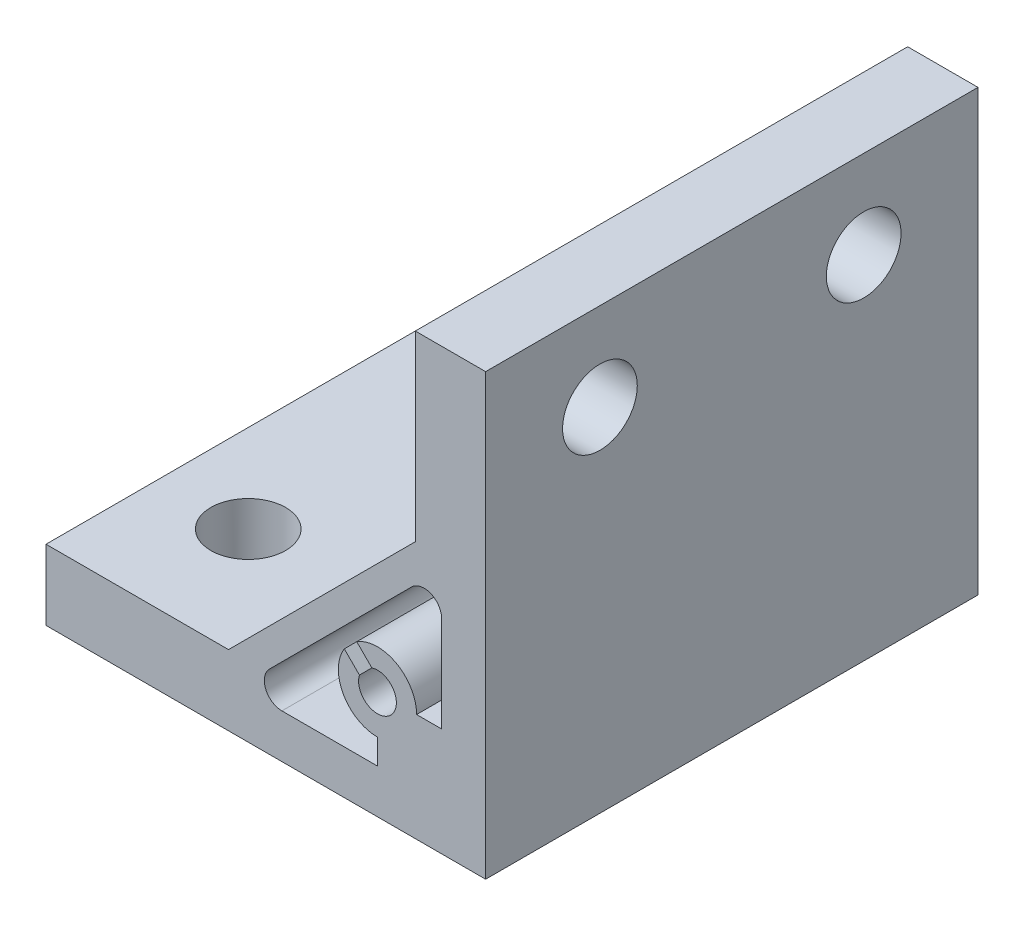
ISO-10303-21;
HEADER;
FILE_DESCRIPTION(('STEP AP214'),'2;1');
FILE_NAME('part.step','',(''),(''),'','','');
FILE_SCHEMA(('AUTOMOTIVE_DESIGN { 1 0 10303 214 1 1 1 1 }'));
ENDSEC;
DATA;
#1=APPLICATION_CONTEXT('core data for automotive mechanical design processes');
#2=APPLICATION_PROTOCOL_DEFINITION('international standard','automotive_design',2000,#1);
#3=PRODUCT_CONTEXT('',#1,'mechanical');
#4=PRODUCT('Part','Part','',(#3));
#5=PRODUCT_RELATED_PRODUCT_CATEGORY('part','',(#4));
#6=PRODUCT_DEFINITION_FORMATION('','',#4);
#7=PRODUCT_DEFINITION_CONTEXT('part definition',#1,'design');
#8=PRODUCT_DEFINITION('design','',#6,#7);
#9=PRODUCT_DEFINITION_SHAPE('','',#8);
#10=(LENGTH_UNIT() NAMED_UNIT(*) SI_UNIT(.MILLI.,.METRE.));
#11=(NAMED_UNIT(*) PLANE_ANGLE_UNIT() SI_UNIT($,.RADIAN.));
#12=(NAMED_UNIT(*) SI_UNIT($,.STERADIAN.) SOLID_ANGLE_UNIT());
#13=UNCERTAINTY_MEASURE_WITH_UNIT(LENGTH_MEASURE(1.E-05),#10,'distance_accuracy_value','');
#14=(GEOMETRIC_REPRESENTATION_CONTEXT(3) GLOBAL_UNCERTAINTY_ASSIGNED_CONTEXT((#13)) GLOBAL_UNIT_ASSIGNED_CONTEXT((#10,
#11,#12)) REPRESENTATION_CONTEXT('',''));
#15=CARTESIAN_POINT('',(0.,0.,0.));
#16=DIRECTION('',(0.,0.,1.));
#17=DIRECTION('',(1.,0.,0.));
#18=AXIS2_PLACEMENT_3D('',#15,#16,#17);
#19=CARTESIAN_POINT('',(50.,0.,28.));
#20=DIRECTION('',(-1.,0.,0.));
#21=DIRECTION('',(0.,0.,1.));
#22=AXIS2_PLACEMENT_3D('',#19,#20,#21);
#23=PLANE('',#22);
#24=CARTESIAN_POINT('',(50.,40.,-15.));
#25=DIRECTION('',(-1.,0.,0.));
#26=DIRECTION('',(0.,0.,1.));
#27=AXIS2_PLACEMENT_3D('',#24,#25,#26);
#28=CIRCLE('',#27,4.25);
#29=CARTESIAN_POINT('',(50.,40.,-10.75));
#30=VERTEX_POINT('',#29);
#31=EDGE_CURVE('E381',#30,#30,#28,.F.);
#32=ORIENTED_EDGE('',*,*,#31,.F.);
#33=EDGE_LOOP('',(#32));
#34=FACE_BOUND('',#33,.T.);
#35=DIRECTION('',(0.,1.,0.));
#36=VECTOR('',#35,1.);
#37=CARTESIAN_POINT('',(50.,0.,-28.));
#38=LINE('',#37,#36);
#39=CARTESIAN_POINT('',(50.,0.,-28.));
#40=VERTEX_POINT('',#39);
#41=CARTESIAN_POINT('',(50.,50.,-28.));
#42=VERTEX_POINT('',#41);
#43=EDGE_CURVE('E283',#40,#42,#38,.T.);
#44=ORIENTED_EDGE('',*,*,#43,.T.);
#45=DIRECTION('',(0.,0.,-1.));
#46=VECTOR('',#45,1.);
#47=CARTESIAN_POINT('',(50.,50.,28.));
#48=LINE('',#47,#46);
#49=CARTESIAN_POINT('',(50.,50.,28.));
#50=VERTEX_POINT('',#49);
#51=EDGE_CURVE('E303',#50,#42,#48,.T.);
#52=ORIENTED_EDGE('',*,*,#51,.F.);
#53=DIRECTION('',(0.,1.,0.));
#54=VECTOR('',#53,1.);
#55=CARTESIAN_POINT('',(50.,0.,28.));
#56=LINE('',#55,#54);
#57=CARTESIAN_POINT('',(50.,0.,28.));
#58=VERTEX_POINT('',#57);
#59=EDGE_CURVE('E268',#58,#50,#56,.T.);
#60=ORIENTED_EDGE('',*,*,#59,.F.);
#61=DIRECTION('',(0.,0.,-1.));
#62=VECTOR('',#61,1.);
#63=CARTESIAN_POINT('',(50.,0.,28.));
#64=LINE('',#63,#62);
#65=EDGE_CURVE('E43',#58,#40,#64,.T.);
#66=ORIENTED_EDGE('',*,*,#65,.T.);
#67=EDGE_LOOP('',(#44,#52,#60,#66));
#68=FACE_BOUND('',#67,.T.);
#69=CARTESIAN_POINT('',(50.,40.,15.));
#70=DIRECTION('',(-1.,0.,0.));
#71=DIRECTION('',(0.,0.,1.));
#72=AXIS2_PLACEMENT_3D('',#69,#70,#71);
#73=CIRCLE('',#72,4.25);
#74=CARTESIAN_POINT('',(50.,40.,19.25));
#75=VERTEX_POINT('',#74);
#76=EDGE_CURVE('E387',#75,#75,#73,.F.);
#77=ORIENTED_EDGE('',*,*,#76,.F.);
#78=EDGE_LOOP('',(#77));
#79=FACE_BOUND('',#78,.T.);
#80=ADVANCED_FACE('F35',(#34,#68,#79),#23,.F.);
#81=CARTESIAN_POINT('',(42.,29.2426406871192,28.));
#82=DIRECTION('',(1.,0.,0.));
#83=DIRECTION('',(0.,0.,-1.));
#84=AXIS2_PLACEMENT_3D('',#81,#82,#83);
#85=PLANE('',#84);
#86=CARTESIAN_POINT('',(42.0000000000001,40.,-15.));
#87=DIRECTION('',(1.,0.,0.));
#88=DIRECTION('',(0.,0.,1.));
#89=AXIS2_PLACEMENT_3D('',#86,#87,#88);
#90=CIRCLE('',#89,4.25);
#91=CARTESIAN_POINT('',(42.0000000000001,40.,-10.75));
#92=VERTEX_POINT('',#91);
#93=EDGE_CURVE('E384',#92,#92,#90,.T.);
#94=ORIENTED_EDGE('',*,*,#93,.T.);
#95=EDGE_LOOP('',(#94));
#96=FACE_BOUND('',#95,.T.);
#97=DIRECTION('',(0.,-1.,0.));
#98=VECTOR('',#97,1.);
#99=CARTESIAN_POINT('',(42.,29.2426406871192,-28.));
#100=LINE('',#99,#98);
#101=CARTESIAN_POINT('',(42.,50.,-28.));
#102=VERTEX_POINT('',#101);
#103=CARTESIAN_POINT('',(42.,29.2426406871192,-28.));
#104=VERTEX_POINT('',#103);
#105=EDGE_CURVE('E287',#102,#104,#100,.T.);
#106=ORIENTED_EDGE('',*,*,#105,.T.);
#107=DIRECTION('',(0.,0.,-1.));
#108=VECTOR('',#107,1.);
#109=CARTESIAN_POINT('',(42.,29.2426406871192,28.));
#110=LINE('',#109,#108);
#111=CARTESIAN_POINT('',(42.,29.2426406871192,28.));
#112=VERTEX_POINT('',#111);
#113=EDGE_CURVE('E297',#112,#104,#110,.T.);
#114=ORIENTED_EDGE('',*,*,#113,.F.);
#115=DIRECTION('',(0.,-1.,0.));
#116=VECTOR('',#115,1.);
#117=CARTESIAN_POINT('',(42.,29.2426406871192,28.));
#118=LINE('',#117,#116);
#119=CARTESIAN_POINT('',(42.,50.,28.));
#120=VERTEX_POINT('',#119);
#121=EDGE_CURVE('E272',#120,#112,#118,.T.);
#122=ORIENTED_EDGE('',*,*,#121,.F.);
#123=DIRECTION('',(0.,0.,-1.));
#124=VECTOR('',#123,1.);
#125=CARTESIAN_POINT('',(42.,50.,28.));
#126=LINE('',#125,#124);
#127=EDGE_CURVE('E300',#120,#102,#126,.T.);
#128=ORIENTED_EDGE('',*,*,#127,.T.);
#129=EDGE_LOOP('',(#106,#114,#122,#128));
#130=FACE_BOUND('',#129,.T.);
#131=CARTESIAN_POINT('',(42.0000000000001,40.,15.));
#132=DIRECTION('',(1.,0.,0.));
#133=DIRECTION('',(0.,0.,-1.));
#134=AXIS2_PLACEMENT_3D('',#131,#132,#133);
#135=CIRCLE('',#134,4.25);
#136=CARTESIAN_POINT('',(42.0000000000001,40.,10.75));
#137=VERTEX_POINT('',#136);
#138=EDGE_CURVE('E390',#137,#137,#135,.T.);
#139=ORIENTED_EDGE('',*,*,#138,.T.);
#140=EDGE_LOOP('',(#139));
#141=FACE_BOUND('',#140,.T.);
#142=ADVANCED_FACE('F326',(#96,#130,#141),#85,.F.);
#143=CARTESIAN_POINT('',(0.,0.,28.));
#144=DIRECTION('',(0.,0.,1.));
#145=DIRECTION('',(1.,0.,0.));
#146=AXIS2_PLACEMENT_3D('',#143,#144,#145);
#147=PLANE('',#146);
#148=DIRECTION('',(0.,-1.,0.));
#149=VECTOR('',#148,1.);
#150=CARTESIAN_POINT('',(0.,8.,28.));
#151=LINE('',#150,#149);
#152=CARTESIAN_POINT('',(0.,8.,28.));
#153=VERTEX_POINT('',#152);
#154=CARTESIAN_POINT('',(0.,0.,28.));
#155=VERTEX_POINT('',#154);
#156=EDGE_CURVE('E262',#153,#155,#151,.T.);
#157=ORIENTED_EDGE('',*,*,#156,.T.);
#158=DIRECTION('',(1.,0.,0.));
#159=VECTOR('',#158,1.);
#160=CARTESIAN_POINT('',(0.,0.,28.));
#161=LINE('',#160,#159);
#162=EDGE_CURVE('E265',#155,#58,#161,.T.);
#163=ORIENTED_EDGE('',*,*,#162,.T.);
#164=ORIENTED_EDGE('',*,*,#59,.T.);
#165=DIRECTION('',(-1.,0.,0.));
#166=VECTOR('',#165,1.);
#167=CARTESIAN_POINT('',(42.,50.,28.));
#168=LINE('',#167,#166);
#169=EDGE_CURVE('E270',#50,#120,#168,.T.);
#170=ORIENTED_EDGE('',*,*,#169,.T.);
#171=ORIENTED_EDGE('',*,*,#121,.T.);
#172=DIRECTION('',(-0.707106781186546,-0.707106781186549,0.));
#173=VECTOR('',#172,1.);
#174=CARTESIAN_POINT('',(20.7573593128809,8.,28.));
#175=LINE('',#174,#173);
#176=CARTESIAN_POINT('',(20.7573593128809,8.,28.));
#177=VERTEX_POINT('',#176);
#178=EDGE_CURVE('E274',#112,#177,#175,.T.);
#179=ORIENTED_EDGE('',*,*,#178,.T.);
#180=DIRECTION('',(-1.,0.,0.));
#181=VECTOR('',#180,1.);
#182=CARTESIAN_POINT('',(0.,8.,28.));
#183=LINE('',#182,#181);
#184=EDGE_CURVE('E276',#177,#153,#183,.T.);
#185=ORIENTED_EDGE('',*,*,#184,.T.);
#186=EDGE_LOOP('',(#157,#163,#164,#170,#171,#179,#185));
#187=FACE_BOUND('',#186,.T.);
#188=DIRECTION('',(0.707106781186549,-0.707106781186546,0.));
#189=VECTOR('',#188,1.);
#190=CARTESIAN_POINT('',(35.647066335444,12.9387201021829,28.));
#191=LINE('',#190,#189);
#192=CARTESIAN_POINT('',(33.9267474297161,14.6590390079109,28.));
#193=VERTEX_POINT('',#192);
#194=CARTESIAN_POINT('',(35.647066335444,12.9387201021829,28.));
#195=VERTEX_POINT('',#194);
#196=EDGE_CURVE('E174',#193,#195,#191,.T.);
#197=ORIENTED_EDGE('',*,*,#196,.F.);
#198=CARTESIAN_POINT('',(37.7,12.3,28.));
#199=DIRECTION('',(0.,0.,-1.));
#200=DIRECTION('',(1.,0.,0.));
#201=AXIS2_PLACEMENT_3D('',#198,#199,#200);
#202=CIRCLE('',#201,4.45);
#203=CARTESIAN_POINT('',(37.7,7.84999999999995,28.));
#204=VERTEX_POINT('',#203);
#205=EDGE_CURVE('E166',#204,#193,#202,.T.);
#206=ORIENTED_EDGE('',*,*,#205,.F.);
#207=DIRECTION('',(0.,1.,0.));
#208=VECTOR('',#207,1.);
#209=CARTESIAN_POINT('',(37.7,5.,28.));
#210=LINE('',#209,#208);
#211=CARTESIAN_POINT('',(37.7,5.,28.));
#212=VERTEX_POINT('',#211);
#213=EDGE_CURVE('E209',#212,#204,#210,.T.);
#214=ORIENTED_EDGE('',*,*,#213,.F.);
#215=DIRECTION('',(1.,0.,0.));
#216=VECTOR('',#215,1.);
#217=CARTESIAN_POINT('',(26.828427124746,5.,28.));
#218=LINE('',#217,#216);
#219=CARTESIAN_POINT('',(26.828427124746,4.99999999999993,28.));
#220=VERTEX_POINT('',#219);
#221=EDGE_CURVE('E207',#220,#212,#218,.T.);
#222=ORIENTED_EDGE('',*,*,#221,.F.);
#223=CARTESIAN_POINT('',(26.8284271247464,7.00000000000011,28.));
#224=DIRECTION('',(0.,0.,1.));
#225=DIRECTION('',(1.,0.,0.));
#226=AXIS2_PLACEMENT_3D('',#223,#224,#225);
#227=CIRCLE('',#226,2.00000000000019);
#228=CARTESIAN_POINT('',(25.4142135623729,8.41421356237311,28.));
#229=VERTEX_POINT('',#228);
#230=EDGE_CURVE('E205',#229,#220,#227,.T.);
#231=ORIENTED_EDGE('',*,*,#230,.F.);
#232=DIRECTION('',(-0.70710678118655,-0.707106781186545,0.));
#233=VECTOR('',#232,1.);
#234=CARTESIAN_POINT('',(25.4142135623729,8.41421356237311,28.));
#235=LINE('',#234,#233);
#236=CARTESIAN_POINT('',(41.585786437627,24.5857864376269,28.));
#237=VERTEX_POINT('',#236);
#238=EDGE_CURVE('E203',#237,#229,#235,.T.);
#239=ORIENTED_EDGE('',*,*,#238,.F.);
#240=CARTESIAN_POINT('',(43.0000000000002,23.171572875254,28.));
#241=DIRECTION('',(0.,0.,1.));
#242=DIRECTION('',(1.,0.,0.));
#243=AXIS2_PLACEMENT_3D('',#240,#241,#242);
#244=CIRCLE('',#243,1.99999999999993);
#245=CARTESIAN_POINT('',(45.,23.1715728752539,28.));
#246=VERTEX_POINT('',#245);
#247=EDGE_CURVE('E201',#246,#237,#244,.T.);
#248=ORIENTED_EDGE('',*,*,#247,.F.);
#249=DIRECTION('',(0.,1.,0.));
#250=VECTOR('',#249,1.);
#251=CARTESIAN_POINT('',(45.,23.1715728752539,28.));
#252=LINE('',#251,#250);
#253=CARTESIAN_POINT('',(45.,12.3,28.));
#254=VERTEX_POINT('',#253);
#255=EDGE_CURVE('E199',#254,#246,#252,.T.);
#256=ORIENTED_EDGE('',*,*,#255,.F.);
#257=DIRECTION('',(1.,0.,0.));
#258=VECTOR('',#257,1.);
#259=CARTESIAN_POINT('',(42.15,12.3,28.));
#260=LINE('',#259,#258);
#261=CARTESIAN_POINT('',(42.15,12.3,28.));
#262=VERTEX_POINT('',#261);
#263=EDGE_CURVE('E197',#262,#254,#260,.T.);
#264=ORIENTED_EDGE('',*,*,#263,.F.);
#265=CARTESIAN_POINT('',(37.7,12.3,28.));
#266=DIRECTION('',(0.,0.,-1.));
#267=DIRECTION('',(1.,0.,0.));
#268=AXIS2_PLACEMENT_3D('',#265,#266,#267);
#269=CIRCLE('',#268,4.45);
#270=CARTESIAN_POINT('',(35.3409609920885,16.0732525702836,28.));
#271=VERTEX_POINT('',#270);
#272=EDGE_CURVE('E195',#271,#262,#269,.T.);
#273=ORIENTED_EDGE('',*,*,#272,.F.);
#274=DIRECTION('',(-0.707106781186684,0.707106781186411,0.));
#275=VECTOR('',#274,1.);
#276=CARTESIAN_POINT('',(37.0612798978168,14.3529336645559,28.));
#277=LINE('',#276,#275);
#278=CARTESIAN_POINT('',(37.0612798978168,14.3529336645559,28.));
#279=VERTEX_POINT('',#278);
#280=EDGE_CURVE('E190',#279,#271,#277,.T.);
#281=ORIENTED_EDGE('',*,*,#280,.F.);
#282=CARTESIAN_POINT('',(37.7,12.3,28.));
#283=DIRECTION('',(0.,0.,1.));
#284=DIRECTION('',(1.,0.,0.));
#285=AXIS2_PLACEMENT_3D('',#282,#283,#284);
#286=CIRCLE('',#285,2.15);
#287=EDGE_CURVE('E188',#195,#279,#286,.T.);
#288=ORIENTED_EDGE('',*,*,#287,.F.);
#289=EDGE_LOOP('',(#197,#206,#214,#222,#231,#239,#248,#256,#264,#273,#281,#288));
#290=FACE_BOUND('',#289,.T.);
#291=ADVANCED_FACE('F186',(#187,#290),#147,.T.);
#292=CARTESIAN_POINT('',(0.,0.,-28.));
#293=DIRECTION('',(0.,0.,1.));
#294=DIRECTION('',(1.,0.,0.));
#295=AXIS2_PLACEMENT_3D('',#292,#293,#294);
#296=PLANE('',#295);
#297=DIRECTION('',(0.,-1.,0.));
#298=VECTOR('',#297,1.);
#299=CARTESIAN_POINT('',(0.,8.,-28.));
#300=LINE('',#299,#298);
#301=CARTESIAN_POINT('',(0.,8.,-28.));
#302=VERTEX_POINT('',#301);
#303=CARTESIAN_POINT('',(0.,0.,-28.));
#304=VERTEX_POINT('',#303);
#305=EDGE_CURVE('E182',#302,#304,#300,.T.);
#306=ORIENTED_EDGE('',*,*,#305,.F.);
#307=DIRECTION('',(-1.,0.,0.));
#308=VECTOR('',#307,1.);
#309=CARTESIAN_POINT('',(0.,8.,-28.));
#310=LINE('',#309,#308);
#311=CARTESIAN_POINT('',(20.7573593128809,8.,-28.));
#312=VERTEX_POINT('',#311);
#313=EDGE_CURVE('E266',#312,#302,#310,.T.);
#314=ORIENTED_EDGE('',*,*,#313,.F.);
#315=DIRECTION('',(-0.707106781186546,-0.707106781186549,0.));
#316=VECTOR('',#315,1.);
#317=CARTESIAN_POINT('',(20.7573593128809,8.,-28.));
#318=LINE('',#317,#316);
#319=EDGE_CURVE('E289',#104,#312,#318,.T.);
#320=ORIENTED_EDGE('',*,*,#319,.F.);
#321=ORIENTED_EDGE('',*,*,#105,.F.);
#322=DIRECTION('',(-1.,0.,0.));
#323=VECTOR('',#322,1.);
#324=CARTESIAN_POINT('',(42.,50.,-28.));
#325=LINE('',#324,#323);
#326=EDGE_CURVE('E285',#42,#102,#325,.T.);
#327=ORIENTED_EDGE('',*,*,#326,.F.);
#328=ORIENTED_EDGE('',*,*,#43,.F.);
#329=DIRECTION('',(1.,0.,0.));
#330=VECTOR('',#329,1.);
#331=CARTESIAN_POINT('',(0.,0.,-28.));
#332=LINE('',#331,#330);
#333=EDGE_CURVE('E281',#304,#40,#332,.T.);
#334=ORIENTED_EDGE('',*,*,#333,.F.);
#335=EDGE_LOOP('',(#306,#314,#320,#321,#327,#328,#334));
#336=FACE_BOUND('',#335,.T.);
#337=CARTESIAN_POINT('',(37.7,12.3,-28.));
#338=DIRECTION('',(0.,0.,-1.));
#339=DIRECTION('',(1.,0.,0.));
#340=AXIS2_PLACEMENT_3D('',#337,#338,#339);
#341=CIRCLE('',#340,4.45);
#342=CARTESIAN_POINT('',(37.7,7.84999999999995,-28.));
#343=VERTEX_POINT('',#342);
#344=CARTESIAN_POINT('',(33.9267474297161,14.6590390079109,-28.));
#345=VERTEX_POINT('',#344);
#346=EDGE_CURVE('E58',#343,#345,#341,.T.);
#347=ORIENTED_EDGE('',*,*,#346,.T.);
#348=DIRECTION('',(0.707106781186549,-0.707106781186546,0.));
#349=VECTOR('',#348,1.);
#350=CARTESIAN_POINT('',(35.647066335444,12.9387201021829,-28.));
#351=LINE('',#350,#349);
#352=CARTESIAN_POINT('',(35.647066335444,12.9387201021829,-28.));
#353=VERTEX_POINT('',#352);
#354=EDGE_CURVE('E181',#345,#353,#351,.T.);
#355=ORIENTED_EDGE('',*,*,#354,.T.);
#356=CARTESIAN_POINT('',(37.7,12.3,-28.));
#357=DIRECTION('',(0.,0.,1.));
#358=DIRECTION('',(1.,0.,0.));
#359=AXIS2_PLACEMENT_3D('',#356,#357,#358);
#360=CIRCLE('',#359,2.15);
#361=CARTESIAN_POINT('',(37.0612798978168,14.3529336645559,-28.));
#362=VERTEX_POINT('',#361);
#363=EDGE_CURVE('E214',#353,#362,#360,.T.);
#364=ORIENTED_EDGE('',*,*,#363,.T.);
#365=DIRECTION('',(-0.707106781186684,0.707106781186411,0.));
#366=VECTOR('',#365,1.);
#367=CARTESIAN_POINT('',(37.0612798978168,14.3529336645559,-28.));
#368=LINE('',#367,#366);
#369=CARTESIAN_POINT('',(35.3409609920885,16.0732525702836,-28.));
#370=VERTEX_POINT('',#369);
#371=EDGE_CURVE('E217',#362,#370,#368,.T.);
#372=ORIENTED_EDGE('',*,*,#371,.T.);
#373=CARTESIAN_POINT('',(37.7,12.3,-28.));
#374=DIRECTION('',(0.,0.,-1.));
#375=DIRECTION('',(1.,0.,0.));
#376=AXIS2_PLACEMENT_3D('',#373,#374,#375);
#377=CIRCLE('',#376,4.45);
#378=CARTESIAN_POINT('',(42.15,12.3,-28.));
#379=VERTEX_POINT('',#378);
#380=EDGE_CURVE('E220',#370,#379,#377,.T.);
#381=ORIENTED_EDGE('',*,*,#380,.T.);
#382=DIRECTION('',(1.,0.,0.));
#383=VECTOR('',#382,1.);
#384=CARTESIAN_POINT('',(42.15,12.3,-28.));
#385=LINE('',#384,#383);
#386=CARTESIAN_POINT('',(45.,12.3,-28.));
#387=VERTEX_POINT('',#386);
#388=EDGE_CURVE('E223',#379,#387,#385,.T.);
#389=ORIENTED_EDGE('',*,*,#388,.T.);
#390=DIRECTION('',(0.,1.,0.));
#391=VECTOR('',#390,1.);
#392=CARTESIAN_POINT('',(45.,23.1715728752539,-28.));
#393=LINE('',#392,#391);
#394=CARTESIAN_POINT('',(45.,23.1715728752539,-28.));
#395=VERTEX_POINT('',#394);
#396=EDGE_CURVE('E226',#387,#395,#393,.T.);
#397=ORIENTED_EDGE('',*,*,#396,.T.);
#398=CARTESIAN_POINT('',(43.0000000000002,23.171572875254,-28.));
#399=DIRECTION('',(0.,0.,1.));
#400=DIRECTION('',(1.,0.,0.));
#401=AXIS2_PLACEMENT_3D('',#398,#399,#400);
#402=CIRCLE('',#401,1.99999999999993);
#403=CARTESIAN_POINT('',(41.585786437627,24.5857864376269,-28.));
#404=VERTEX_POINT('',#403);
#405=EDGE_CURVE('E229',#395,#404,#402,.T.);
#406=ORIENTED_EDGE('',*,*,#405,.T.);
#407=DIRECTION('',(-0.70710678118655,-0.707106781186545,0.));
#408=VECTOR('',#407,1.);
#409=CARTESIAN_POINT('',(25.4142135623729,8.41421356237311,-28.));
#410=LINE('',#409,#408);
#411=CARTESIAN_POINT('',(25.4142135623729,8.41421356237311,-28.));
#412=VERTEX_POINT('',#411);
#413=EDGE_CURVE('E232',#404,#412,#410,.T.);
#414=ORIENTED_EDGE('',*,*,#413,.T.);
#415=CARTESIAN_POINT('',(26.8284271247464,7.00000000000011,-28.));
#416=DIRECTION('',(0.,0.,1.));
#417=DIRECTION('',(1.,0.,0.));
#418=AXIS2_PLACEMENT_3D('',#415,#416,#417);
#419=CIRCLE('',#418,2.00000000000019);
#420=CARTESIAN_POINT('',(26.828427124746,4.99999999999993,-28.));
#421=VERTEX_POINT('',#420);
#422=EDGE_CURVE('E235',#412,#421,#419,.T.);
#423=ORIENTED_EDGE('',*,*,#422,.T.);
#424=DIRECTION('',(1.,0.,0.));
#425=VECTOR('',#424,1.);
#426=CARTESIAN_POINT('',(26.828427124746,5.,-28.));
#427=LINE('',#426,#425);
#428=CARTESIAN_POINT('',(37.7,5.,-28.));
#429=VERTEX_POINT('',#428);
#430=EDGE_CURVE('E238',#421,#429,#427,.T.);
#431=ORIENTED_EDGE('',*,*,#430,.T.);
#432=DIRECTION('',(0.,1.,0.));
#433=VECTOR('',#432,1.);
#434=CARTESIAN_POINT('',(37.7,5.,-28.));
#435=LINE('',#434,#433);
#436=EDGE_CURVE('E175',#429,#343,#435,.T.);
#437=ORIENTED_EDGE('',*,*,#436,.T.);
#438=EDGE_LOOP('',(#347,#355,#364,#372,#381,#389,#397,#406,#414,#423,#431,#437));
#439=FACE_BOUND('',#438,.T.);
#440=ADVANCED_FACE('F316',(#336,#439),#296,.F.);
#441=CARTESIAN_POINT('',(0.,8.,28.));
#442=DIRECTION('',(1.,0.,0.));
#443=DIRECTION('',(0.,0.,-1.));
#444=AXIS2_PLACEMENT_3D('',#441,#442,#443);
#445=PLANE('',#444);
#446=ORIENTED_EDGE('',*,*,#305,.T.);
#447=DIRECTION('',(0.,0.,-1.));
#448=VECTOR('',#447,1.);
#449=CARTESIAN_POINT('',(0.,0.,28.));
#450=LINE('',#449,#448);
#451=EDGE_CURVE('E11',#155,#304,#450,.T.);
#452=ORIENTED_EDGE('',*,*,#451,.F.);
#453=ORIENTED_EDGE('',*,*,#156,.F.);
#454=DIRECTION('',(0.,0.,-1.));
#455=VECTOR('',#454,1.);
#456=CARTESIAN_POINT('',(0.,8.,28.));
#457=LINE('',#456,#455);
#458=EDGE_CURVE('E278',#153,#302,#457,.T.);
#459=ORIENTED_EDGE('',*,*,#458,.T.);
#460=EDGE_LOOP('',(#446,#452,#453,#459));
#461=FACE_BOUND('',#460,.T.);
#462=ADVANCED_FACE('F37',(#461),#445,.F.);
#463=CARTESIAN_POINT('',(0.,0.,28.));
#464=DIRECTION('',(0.,1.,0.));
#465=DIRECTION('',(0.,0.,1.));
#466=AXIS2_PLACEMENT_3D('',#463,#464,#465);
#467=PLANE('',#466);
#468=CARTESIAN_POINT('',(10.,0.,15.));
#469=DIRECTION('',(0.,1.,0.));
#470=DIRECTION('',(0.,0.,1.));
#471=AXIS2_PLACEMENT_3D('',#468,#469,#470);
#472=CIRCLE('',#471,4.25);
#473=CARTESIAN_POINT('',(10.,0.,19.25));
#474=VERTEX_POINT('',#473);
#475=EDGE_CURVE('E369',#474,#474,#472,.T.);
#476=ORIENTED_EDGE('',*,*,#475,.T.);
#477=EDGE_LOOP('',(#476));
#478=FACE_BOUND('',#477,.T.);
#479=CARTESIAN_POINT('',(10.,0.,-15.));
#480=DIRECTION('',(0.,1.,0.));
#481=DIRECTION('',(0.,0.,1.));
#482=AXIS2_PLACEMENT_3D('',#479,#480,#481);
#483=CIRCLE('',#482,4.25);
#484=CARTESIAN_POINT('',(10.,0.,-10.75));
#485=VERTEX_POINT('',#484);
#486=EDGE_CURVE('E212',#485,#485,#483,.T.);
#487=ORIENTED_EDGE('',*,*,#486,.T.);
#488=EDGE_LOOP('',(#487));
#489=FACE_BOUND('',#488,.T.);
#490=ORIENTED_EDGE('',*,*,#333,.T.);
#491=ORIENTED_EDGE('',*,*,#65,.F.);
#492=ORIENTED_EDGE('',*,*,#162,.F.);
#493=ORIENTED_EDGE('',*,*,#451,.T.);
#494=EDGE_LOOP('',(#490,#491,#492,#493));
#495=FACE_BOUND('',#494,.T.);
#496=ADVANCED_FACE('F334',(#478,#489,#495),#467,.F.);
#497=CARTESIAN_POINT('',(42.,50.,28.));
#498=DIRECTION('',(0.,-1.,0.));
#499=DIRECTION('',(0.,0.,-1.));
#500=AXIS2_PLACEMENT_3D('',#497,#498,#499);
#501=PLANE('',#500);
#502=ORIENTED_EDGE('',*,*,#326,.T.);
#503=ORIENTED_EDGE('',*,*,#127,.F.);
#504=ORIENTED_EDGE('',*,*,#169,.F.);
#505=ORIENTED_EDGE('',*,*,#51,.T.);
#506=EDGE_LOOP('',(#502,#503,#504,#505));
#507=FACE_BOUND('',#506,.T.);
#508=ADVANCED_FACE('F322',(#507),#501,.F.);
#509=CARTESIAN_POINT('',(20.7573593128809,8.,28.));
#510=DIRECTION('',(0.707106781186549,-0.707106781186546,0.));
#511=DIRECTION('',(0.707106781186546,0.707106781186549,0.));
#512=AXIS2_PLACEMENT_3D('',#509,#510,#511);
#513=PLANE('',#512);
#514=ORIENTED_EDGE('',*,*,#319,.T.);
#515=DIRECTION('',(0.,0.,-1.));
#516=VECTOR('',#515,1.);
#517=CARTESIAN_POINT('',(20.7573593128809,8.,28.));
#518=LINE('',#517,#516);
#519=EDGE_CURVE('E294',#177,#312,#518,.T.);
#520=ORIENTED_EDGE('',*,*,#519,.F.);
#521=ORIENTED_EDGE('',*,*,#178,.F.);
#522=ORIENTED_EDGE('',*,*,#113,.T.);
#523=EDGE_LOOP('',(#514,#520,#521,#522));
#524=FACE_BOUND('',#523,.T.);
#525=ADVANCED_FACE('F342',(#524),#513,.F.);
#526=CARTESIAN_POINT('',(0.,8.,28.));
#527=DIRECTION('',(0.,-1.,0.));
#528=DIRECTION('',(0.,0.,-1.));
#529=AXIS2_PLACEMENT_3D('',#526,#527,#528);
#530=PLANE('',#529);
#531=CARTESIAN_POINT('',(10.,8.,15.));
#532=DIRECTION('',(0.,1.,0.));
#533=DIRECTION('',(0.,0.,-1.));
#534=AXIS2_PLACEMENT_3D('',#531,#532,#533);
#535=CIRCLE('',#534,4.25);
#536=CARTESIAN_POINT('',(10.,8.,10.75));
#537=VERTEX_POINT('',#536);
#538=EDGE_CURVE('E378',#537,#537,#535,.T.);
#539=ORIENTED_EDGE('',*,*,#538,.F.);
#540=EDGE_LOOP('',(#539));
#541=FACE_BOUND('',#540,.T.);
#542=CARTESIAN_POINT('',(10.,8.,-15.));
#543=DIRECTION('',(0.,1.,0.));
#544=DIRECTION('',(0.,0.,1.));
#545=AXIS2_PLACEMENT_3D('',#542,#543,#544);
#546=CIRCLE('',#545,4.25);
#547=CARTESIAN_POINT('',(10.,8.,-10.75));
#548=VERTEX_POINT('',#547);
#549=EDGE_CURVE('E373',#548,#548,#546,.T.);
#550=ORIENTED_EDGE('',*,*,#549,.F.);
#551=EDGE_LOOP('',(#550));
#552=FACE_BOUND('',#551,.T.);
#553=ORIENTED_EDGE('',*,*,#313,.T.);
#554=ORIENTED_EDGE('',*,*,#458,.F.);
#555=ORIENTED_EDGE('',*,*,#184,.F.);
#556=ORIENTED_EDGE('',*,*,#519,.T.);
#557=EDGE_LOOP('',(#553,#554,#555,#556));
#558=FACE_BOUND('',#557,.T.);
#559=ADVANCED_FACE('F339',(#541,#552,#558),#530,.F.);
#560=CARTESIAN_POINT('',(37.7,12.3,28.));
#561=DIRECTION('',(0.,0.,-1.));
#562=DIRECTION('',(-1.,0.,0.));
#563=AXIS2_PLACEMENT_3D('',#560,#561,#562);
#564=CYLINDRICAL_SURFACE('',#563,4.45);
#565=ORIENTED_EDGE('',*,*,#346,.F.);
#566=DIRECTION('',(0.,0.,-1.));
#567=VECTOR('',#566,1.);
#568=CARTESIAN_POINT('',(37.7,7.84999999999995,28.));
#569=LINE('',#568,#567);
#570=EDGE_CURVE('E170',#204,#343,#569,.T.);
#571=ORIENTED_EDGE('',*,*,#570,.F.);
#572=ORIENTED_EDGE('',*,*,#205,.T.);
#573=DIRECTION('',(0.,0.,-1.));
#574=VECTOR('',#573,1.);
#575=CARTESIAN_POINT('',(33.9267474297161,14.6590390079109,28.));
#576=LINE('',#575,#574);
#577=EDGE_CURVE('E169',#193,#345,#576,.T.);
#578=ORIENTED_EDGE('',*,*,#577,.T.);
#579=EDGE_LOOP('',(#565,#571,#572,#578));
#580=FACE_BOUND('',#579,.T.);
#581=ADVANCED_FACE('F168',(#580),#564,.T.);
#582=CARTESIAN_POINT('',(35.647066335444,12.9387201021829,28.));
#583=DIRECTION('',(0.707106781186546,0.707106781186549,0.));
#584=DIRECTION('',(-0.707106781186549,0.707106781186546,0.));
#585=AXIS2_PLACEMENT_3D('',#582,#583,#584);
#586=PLANE('',#585);
#587=ORIENTED_EDGE('',*,*,#354,.F.);
#588=ORIENTED_EDGE('',*,*,#577,.F.);
#589=ORIENTED_EDGE('',*,*,#196,.T.);
#590=DIRECTION('',(0.,0.,-1.));
#591=VECTOR('',#590,1.);
#592=CARTESIAN_POINT('',(35.647066335444,12.9387201021829,28.));
#593=LINE('',#592,#591);
#594=EDGE_CURVE('E183',#195,#353,#593,.T.);
#595=ORIENTED_EDGE('',*,*,#594,.T.);
#596=EDGE_LOOP('',(#587,#588,#589,#595));
#597=FACE_BOUND('',#596,.T.);
#598=ADVANCED_FACE('F178',(#597),#586,.T.);
#599=CARTESIAN_POINT('',(37.7,12.3,28.));
#600=DIRECTION('',(0.,0.,-1.));
#601=DIRECTION('',(-1.,0.,0.));
#602=AXIS2_PLACEMENT_3D('',#599,#600,#601);
#603=CYLINDRICAL_SURFACE('',#602,2.15);
#604=ORIENTED_EDGE('',*,*,#363,.F.);
#605=ORIENTED_EDGE('',*,*,#594,.F.);
#606=ORIENTED_EDGE('',*,*,#287,.T.);
#607=DIRECTION('',(0.,0.,-1.));
#608=VECTOR('',#607,1.);
#609=CARTESIAN_POINT('',(37.0612798978168,14.3529336645559,28.));
#610=LINE('',#609,#608);
#611=EDGE_CURVE('E259',#279,#362,#610,.T.);
#612=ORIENTED_EDGE('',*,*,#611,.T.);
#613=EDGE_LOOP('',(#604,#605,#606,#612));
#614=FACE_BOUND('',#613,.T.);
#615=ADVANCED_FACE('F448',(#614),#603,.F.);
#616=CARTESIAN_POINT('',(37.0612798978168,14.3529336645559,28.));
#617=DIRECTION('',(-0.707106781186411,-0.707106781186684,0.));
#618=DIRECTION('',(0.707106781186684,-0.707106781186411,0.));
#619=AXIS2_PLACEMENT_3D('',#616,#617,#618);
#620=PLANE('',#619);
#621=ORIENTED_EDGE('',*,*,#371,.F.);
#622=ORIENTED_EDGE('',*,*,#611,.F.);
#623=ORIENTED_EDGE('',*,*,#280,.T.);
#624=DIRECTION('',(0.,0.,-1.));
#625=VECTOR('',#624,1.);
#626=CARTESIAN_POINT('',(35.3409609920885,16.0732525702836,28.));
#627=LINE('',#626,#625);
#628=EDGE_CURVE('E257',#271,#370,#627,.T.);
#629=ORIENTED_EDGE('',*,*,#628,.T.);
#630=EDGE_LOOP('',(#621,#622,#623,#629));
#631=FACE_BOUND('',#630,.T.);
#632=ADVANCED_FACE('F444',(#631),#620,.T.);
#633=CARTESIAN_POINT('',(37.7,12.3,28.));
#634=DIRECTION('',(0.,0.,-1.));
#635=DIRECTION('',(-1.,0.,0.));
#636=AXIS2_PLACEMENT_3D('',#633,#634,#635);
#637=CYLINDRICAL_SURFACE('',#636,4.45);
#638=ORIENTED_EDGE('',*,*,#380,.F.);
#639=ORIENTED_EDGE('',*,*,#628,.F.);
#640=ORIENTED_EDGE('',*,*,#272,.T.);
#641=DIRECTION('',(0.,0.,-1.));
#642=VECTOR('',#641,1.);
#643=CARTESIAN_POINT('',(42.15,12.3,28.));
#644=LINE('',#643,#642);
#645=EDGE_CURVE('E255',#262,#379,#644,.T.);
#646=ORIENTED_EDGE('',*,*,#645,.T.);
#647=EDGE_LOOP('',(#638,#639,#640,#646));
#648=FACE_BOUND('',#647,.T.);
#649=ADVANCED_FACE('F440',(#648),#637,.T.);
#650=CARTESIAN_POINT('',(42.15,12.3,28.));
#651=DIRECTION('',(0.,1.,0.));
#652=DIRECTION('',(0.,0.,1.));
#653=AXIS2_PLACEMENT_3D('',#650,#651,#652);
#654=PLANE('',#653);
#655=ORIENTED_EDGE('',*,*,#388,.F.);
#656=ORIENTED_EDGE('',*,*,#645,.F.);
#657=ORIENTED_EDGE('',*,*,#263,.T.);
#658=DIRECTION('',(0.,0.,-1.));
#659=VECTOR('',#658,1.);
#660=CARTESIAN_POINT('',(45.,12.3,28.));
#661=LINE('',#660,#659);
#662=EDGE_CURVE('E253',#254,#387,#661,.T.);
#663=ORIENTED_EDGE('',*,*,#662,.T.);
#664=EDGE_LOOP('',(#655,#656,#657,#663));
#665=FACE_BOUND('',#664,.T.);
#666=ADVANCED_FACE('F436',(#665),#654,.T.);
#667=CARTESIAN_POINT('',(45.,23.1715728752539,28.));
#668=DIRECTION('',(-1.,0.,0.));
#669=DIRECTION('',(0.,0.,1.));
#670=AXIS2_PLACEMENT_3D('',#667,#668,#669);
#671=PLANE('',#670);
#672=ORIENTED_EDGE('',*,*,#396,.F.);
#673=ORIENTED_EDGE('',*,*,#662,.F.);
#674=ORIENTED_EDGE('',*,*,#255,.T.);
#675=DIRECTION('',(0.,0.,-1.));
#676=VECTOR('',#675,1.);
#677=CARTESIAN_POINT('',(45.,23.1715728752539,28.));
#678=LINE('',#677,#676);
#679=EDGE_CURVE('E251',#246,#395,#678,.T.);
#680=ORIENTED_EDGE('',*,*,#679,.T.);
#681=EDGE_LOOP('',(#672,#673,#674,#680));
#682=FACE_BOUND('',#681,.T.);
#683=ADVANCED_FACE('F432',(#682),#671,.T.);
#684=CARTESIAN_POINT('',(43.0000000000002,23.171572875254,28.));
#685=DIRECTION('',(0.,0.,-1.));
#686=DIRECTION('',(-1.,0.,0.));
#687=AXIS2_PLACEMENT_3D('',#684,#685,#686);
#688=CYLINDRICAL_SURFACE('',#687,1.99999999999993);
#689=ORIENTED_EDGE('',*,*,#405,.F.);
#690=ORIENTED_EDGE('',*,*,#679,.F.);
#691=ORIENTED_EDGE('',*,*,#247,.T.);
#692=DIRECTION('',(0.,0.,-1.));
#693=VECTOR('',#692,1.);
#694=CARTESIAN_POINT('',(41.585786437627,24.5857864376269,28.));
#695=LINE('',#694,#693);
#696=EDGE_CURVE('E249',#237,#404,#695,.T.);
#697=ORIENTED_EDGE('',*,*,#696,.T.);
#698=EDGE_LOOP('',(#689,#690,#691,#697));
#699=FACE_BOUND('',#698,.T.);
#700=ADVANCED_FACE('F428',(#699),#688,.F.);
#701=CARTESIAN_POINT('',(25.4142135623729,8.41421356237311,28.));
#702=DIRECTION('',(0.707106781186545,-0.70710678118655,0.));
#703=DIRECTION('',(0.70710678118655,0.707106781186545,0.));
#704=AXIS2_PLACEMENT_3D('',#701,#702,#703);
#705=PLANE('',#704);
#706=ORIENTED_EDGE('',*,*,#413,.F.);
#707=ORIENTED_EDGE('',*,*,#696,.F.);
#708=ORIENTED_EDGE('',*,*,#238,.T.);
#709=DIRECTION('',(0.,0.,-1.));
#710=VECTOR('',#709,1.);
#711=CARTESIAN_POINT('',(25.4142135623729,8.41421356237311,28.));
#712=LINE('',#711,#710);
#713=EDGE_CURVE('E247',#229,#412,#712,.T.);
#714=ORIENTED_EDGE('',*,*,#713,.T.);
#715=EDGE_LOOP('',(#706,#707,#708,#714));
#716=FACE_BOUND('',#715,.T.);
#717=ADVANCED_FACE('F424',(#716),#705,.T.);
#718=CARTESIAN_POINT('',(26.8284271247464,7.00000000000011,28.));
#719=DIRECTION('',(0.,0.,-1.));
#720=DIRECTION('',(-1.,0.,0.));
#721=AXIS2_PLACEMENT_3D('',#718,#719,#720);
#722=CYLINDRICAL_SURFACE('',#721,2.00000000000019);
#723=ORIENTED_EDGE('',*,*,#422,.F.);
#724=ORIENTED_EDGE('',*,*,#713,.F.);
#725=ORIENTED_EDGE('',*,*,#230,.T.);
#726=DIRECTION('',(0.,0.,-1.));
#727=VECTOR('',#726,1.);
#728=CARTESIAN_POINT('',(26.828427124746,4.99999999999993,28.));
#729=LINE('',#728,#727);
#730=EDGE_CURVE('E245',#220,#421,#729,.T.);
#731=ORIENTED_EDGE('',*,*,#730,.T.);
#732=EDGE_LOOP('',(#723,#724,#725,#731));
#733=FACE_BOUND('',#732,.T.);
#734=ADVANCED_FACE('F420',(#733),#722,.F.);
#735=CARTESIAN_POINT('',(26.828427124746,5.,28.));
#736=DIRECTION('',(0.,1.,0.));
#737=DIRECTION('',(0.,0.,1.));
#738=AXIS2_PLACEMENT_3D('',#735,#736,#737);
#739=PLANE('',#738);
#740=ORIENTED_EDGE('',*,*,#430,.F.);
#741=ORIENTED_EDGE('',*,*,#730,.F.);
#742=ORIENTED_EDGE('',*,*,#221,.T.);
#743=DIRECTION('',(0.,0.,-1.));
#744=VECTOR('',#743,1.);
#745=CARTESIAN_POINT('',(37.7,5.,28.));
#746=LINE('',#745,#744);
#747=EDGE_CURVE('E50',#212,#429,#746,.T.);
#748=ORIENTED_EDGE('',*,*,#747,.T.);
#749=EDGE_LOOP('',(#740,#741,#742,#748));
#750=FACE_BOUND('',#749,.T.);
#751=ADVANCED_FACE('F417',(#750),#739,.T.);
#752=CARTESIAN_POINT('',(37.7,5.,28.));
#753=DIRECTION('',(-1.,0.,0.));
#754=DIRECTION('',(0.,0.,1.));
#755=AXIS2_PLACEMENT_3D('',#752,#753,#754);
#756=PLANE('',#755);
#757=ORIENTED_EDGE('',*,*,#436,.F.);
#758=ORIENTED_EDGE('',*,*,#747,.F.);
#759=ORIENTED_EDGE('',*,*,#213,.T.);
#760=ORIENTED_EDGE('',*,*,#570,.T.);
#761=EDGE_LOOP('',(#757,#758,#759,#760));
#762=FACE_BOUND('',#761,.T.);
#763=ADVANCED_FACE('F413',(#762),#756,.T.);
#764=CARTESIAN_POINT('',(10.,-48.,-15.));
#765=DIRECTION('',(0.,1.,0.));
#766=DIRECTION('',(0.,0.,1.));
#767=AXIS2_PLACEMENT_3D('',#764,#765,#766);
#768=CYLINDRICAL_SURFACE('',#767,4.25);
#769=ORIENTED_EDGE('',*,*,#549,.T.);
#770=EDGE_LOOP('',(#769));
#771=FACE_BOUND('',#770,.T.);
#772=ORIENTED_EDGE('',*,*,#486,.F.);
#773=EDGE_LOOP('',(#772));
#774=FACE_BOUND('',#773,.T.);
#775=ADVANCED_FACE('F409',(#771,#774),#768,.F.);
#776=CARTESIAN_POINT('',(10.,-48.,15.));
#777=DIRECTION('',(0.,1.,0.));
#778=DIRECTION('',(0.,0.,1.));
#779=AXIS2_PLACEMENT_3D('',#776,#777,#778);
#780=CYLINDRICAL_SURFACE('',#779,4.25);
#781=ORIENTED_EDGE('',*,*,#538,.T.);
#782=EDGE_LOOP('',(#781));
#783=FACE_BOUND('',#782,.T.);
#784=ORIENTED_EDGE('',*,*,#475,.F.);
#785=EDGE_LOOP('',(#784));
#786=FACE_BOUND('',#785,.T.);
#787=ADVANCED_FACE('F403',(#783,#786),#780,.F.);
#788=CARTESIAN_POINT('',(98.0000000000001,39.9999999999999,-15.));
#789=DIRECTION('',(-1.,0.,0.));
#790=DIRECTION('',(0.,-1.,0.));
#791=AXIS2_PLACEMENT_3D('',#788,#789,#790);
#792=CYLINDRICAL_SURFACE('',#791,4.25);
#793=ORIENTED_EDGE('',*,*,#93,.F.);
#794=EDGE_LOOP('',(#793));
#795=FACE_BOUND('',#794,.T.);
#796=ORIENTED_EDGE('',*,*,#31,.T.);
#797=EDGE_LOOP('',(#796));
#798=FACE_BOUND('',#797,.T.);
#799=ADVANCED_FACE('F397',(#795,#798),#792,.F.);
#800=CARTESIAN_POINT('',(98.0000000000001,39.9999999999999,15.));
#801=DIRECTION('',(-1.,0.,0.));
#802=DIRECTION('',(0.,-1.,0.));
#803=AXIS2_PLACEMENT_3D('',#800,#801,#802);
#804=CYLINDRICAL_SURFACE('',#803,4.25);
#805=ORIENTED_EDGE('',*,*,#138,.F.);
#806=EDGE_LOOP('',(#805));
#807=FACE_BOUND('',#806,.T.);
#808=ORIENTED_EDGE('',*,*,#76,.T.);
#809=EDGE_LOOP('',(#808));
#810=FACE_BOUND('',#809,.T.);
#811=ADVANCED_FACE('F394',(#807,#810),#804,.F.);
#812=CLOSED_SHELL('',(#80,#142,#291,#440,#462,#496,#508,#525,#559,#581,#598,#615,#632,#649,#666,
#683,#700,#717,#734,#751,#763,#775,#787,#799,#811));
#813=MANIFOLD_SOLID_BREP('B2',#812);
#814=ADVANCED_BREP_SHAPE_REPRESENTATION('',(#18,#813),#14);
#815=SHAPE_DEFINITION_REPRESENTATION(#9,#814);
ENDSEC;
END-ISO-10303-21;
